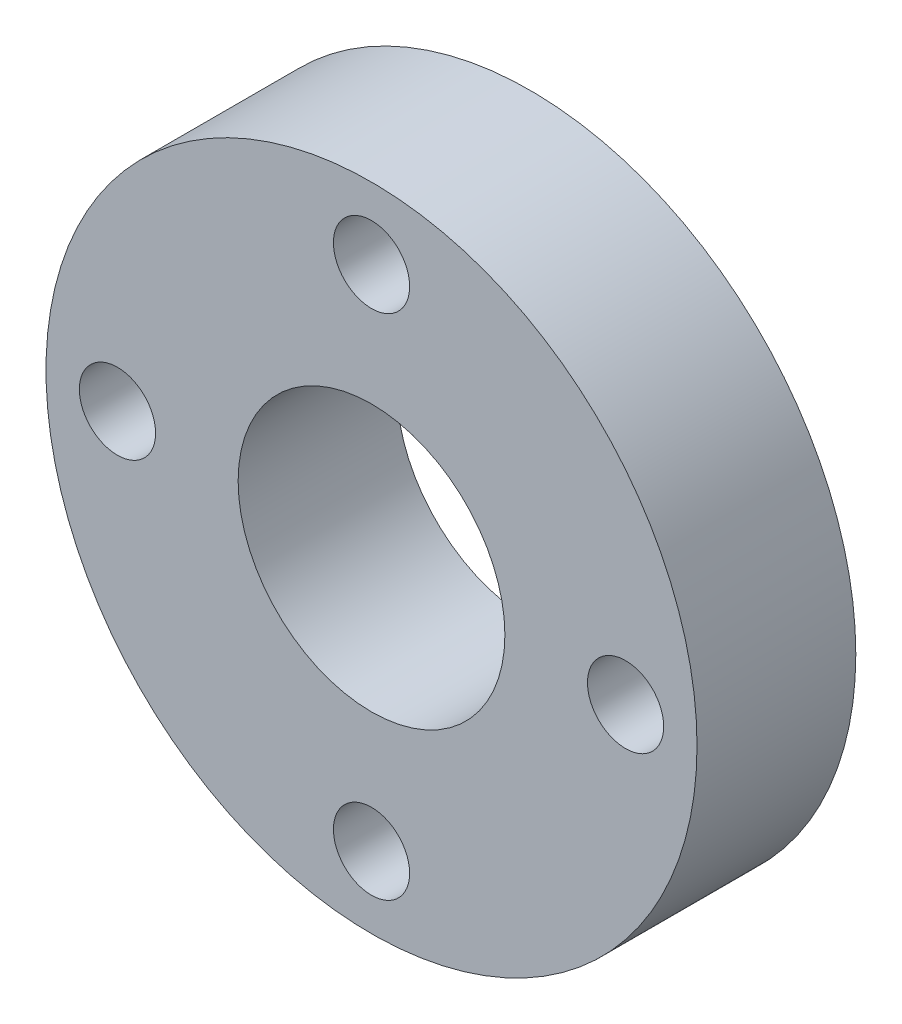
ISO-10303-21;
HEADER;
FILE_DESCRIPTION(('STEP AP214'),'2;1');
FILE_NAME('part.step','',(''),(''),'','','');
FILE_SCHEMA(('AUTOMOTIVE_DESIGN { 1 0 10303 214 1 1 1 1 }'));
ENDSEC;
DATA;
#1=APPLICATION_CONTEXT('core data for automotive mechanical design processes');
#2=APPLICATION_PROTOCOL_DEFINITION('international standard','automotive_design',2000,#1);
#3=PRODUCT_CONTEXT('',#1,'mechanical');
#4=PRODUCT('Part','Part','',(#3));
#5=PRODUCT_RELATED_PRODUCT_CATEGORY('part','',(#4));
#6=PRODUCT_DEFINITION_FORMATION('','',#4);
#7=PRODUCT_DEFINITION_CONTEXT('part definition',#1,'design');
#8=PRODUCT_DEFINITION('design','',#6,#7);
#9=PRODUCT_DEFINITION_SHAPE('','',#8);
#10=(LENGTH_UNIT() NAMED_UNIT(*) SI_UNIT(.MILLI.,.METRE.));
#11=(NAMED_UNIT(*) PLANE_ANGLE_UNIT() SI_UNIT($,.RADIAN.));
#12=(NAMED_UNIT(*) SI_UNIT($,.STERADIAN.) SOLID_ANGLE_UNIT());
#13=UNCERTAINTY_MEASURE_WITH_UNIT(LENGTH_MEASURE(1.E-05),#10,'distance_accuracy_value','');
#14=(GEOMETRIC_REPRESENTATION_CONTEXT(3) GLOBAL_UNCERTAINTY_ASSIGNED_CONTEXT((#13)) GLOBAL_UNIT_ASSIGNED_CONTEXT((#10,
#11,#12)) REPRESENTATION_CONTEXT('',''));
#15=CARTESIAN_POINT('',(0.,0.,0.));
#16=DIRECTION('',(0.,0.,1.));
#17=DIRECTION('',(1.,0.,0.));
#18=AXIS2_PLACEMENT_3D('',#15,#16,#17);
#19=CARTESIAN_POINT('',(0.,0.,5.));
#20=DIRECTION('',(0.,0.,-1.));
#21=DIRECTION('',(-1.,0.,0.));
#22=AXIS2_PLACEMENT_3D('',#19,#20,#21);
#23=CYLINDRICAL_SURFACE('',#22,10.25);
#24=CARTESIAN_POINT('',(0.,0.,5.));
#25=DIRECTION('',(0.,0.,1.));
#26=DIRECTION('',(1.,0.,0.));
#27=AXIS2_PLACEMENT_3D('',#24,#25,#26);
#28=CIRCLE('',#27,10.25);
#29=CARTESIAN_POINT('',(10.25,0.,5.));
#30=VERTEX_POINT('',#29);
#31=EDGE_CURVE('E49',#30,#30,#28,.T.);
#32=ORIENTED_EDGE('',*,*,#31,.F.);
#33=EDGE_LOOP('',(#32));
#34=FACE_BOUND('',#33,.T.);
#35=CARTESIAN_POINT('',(0.,0.,0.));
#36=DIRECTION('',(0.,0.,1.));
#37=DIRECTION('',(1.,0.,0.));
#38=AXIS2_PLACEMENT_3D('',#35,#36,#37);
#39=CIRCLE('',#38,10.25);
#40=CARTESIAN_POINT('',(10.25,0.,0.));
#41=VERTEX_POINT('',#40);
#42=EDGE_CURVE('E69',#41,#41,#39,.T.);
#43=ORIENTED_EDGE('',*,*,#42,.T.);
#44=EDGE_LOOP('',(#43));
#45=FACE_BOUND('',#44,.T.);
#46=ADVANCED_FACE('F41',(#34,#45),#23,.T.);
#47=CARTESIAN_POINT('',(0.,-8.,5.));
#48=DIRECTION('',(0.,0.,-1.));
#49=DIRECTION('',(-1.,0.,0.));
#50=AXIS2_PLACEMENT_3D('',#47,#48,#49);
#51=CYLINDRICAL_SURFACE('',#50,1.2);
#52=CARTESIAN_POINT('',(0.,-8.,5.));
#53=DIRECTION('',(0.,0.,1.));
#54=DIRECTION('',(1.,0.,0.));
#55=AXIS2_PLACEMENT_3D('',#52,#53,#54);
#56=CIRCLE('',#55,1.2);
#57=CARTESIAN_POINT('',(1.19999999999994,-8.,5.));
#58=VERTEX_POINT('',#57);
#59=EDGE_CURVE('E54',#58,#58,#56,.T.);
#60=ORIENTED_EDGE('',*,*,#59,.T.);
#61=EDGE_LOOP('',(#60));
#62=FACE_BOUND('',#61,.T.);
#63=CARTESIAN_POINT('',(0.,-8.,0.));
#64=DIRECTION('',(0.,0.,1.));
#65=DIRECTION('',(1.,0.,0.));
#66=AXIS2_PLACEMENT_3D('',#63,#64,#65);
#67=CIRCLE('',#66,1.2);
#68=CARTESIAN_POINT('',(1.19999999999994,-8.,0.));
#69=VERTEX_POINT('',#68);
#70=EDGE_CURVE('E67',#69,#69,#67,.T.);
#71=ORIENTED_EDGE('',*,*,#70,.F.);
#72=EDGE_LOOP('',(#71));
#73=FACE_BOUND('',#72,.T.);
#74=ADVANCED_FACE('F90',(#62,#73),#51,.F.);
#75=CARTESIAN_POINT('',(8.,0.,5.));
#76=DIRECTION('',(0.,0.,-1.));
#77=DIRECTION('',(-1.,0.,0.));
#78=AXIS2_PLACEMENT_3D('',#75,#76,#77);
#79=CYLINDRICAL_SURFACE('',#78,1.2);
#80=CARTESIAN_POINT('',(8.,0.,5.));
#81=DIRECTION('',(0.,0.,1.));
#82=DIRECTION('',(1.,0.,0.));
#83=AXIS2_PLACEMENT_3D('',#80,#81,#82);
#84=CIRCLE('',#83,1.2);
#85=CARTESIAN_POINT('',(9.2,0.,5.));
#86=VERTEX_POINT('',#85);
#87=EDGE_CURVE('E83',#86,#86,#84,.T.);
#88=ORIENTED_EDGE('',*,*,#87,.T.);
#89=EDGE_LOOP('',(#88));
#90=FACE_BOUND('',#89,.T.);
#91=CARTESIAN_POINT('',(8.,0.,0.));
#92=DIRECTION('',(0.,0.,1.));
#93=DIRECTION('',(1.,0.,0.));
#94=AXIS2_PLACEMENT_3D('',#91,#92,#93);
#95=CIRCLE('',#94,1.2);
#96=CARTESIAN_POINT('',(9.2,0.,0.));
#97=VERTEX_POINT('',#96);
#98=EDGE_CURVE('E64',#97,#97,#95,.T.);
#99=ORIENTED_EDGE('',*,*,#98,.F.);
#100=EDGE_LOOP('',(#99));
#101=FACE_BOUND('',#100,.T.);
#102=ADVANCED_FACE('F108',(#90,#101),#79,.F.);
#103=CARTESIAN_POINT('',(0.,8.,5.));
#104=DIRECTION('',(0.,0.,-1.));
#105=DIRECTION('',(-1.,0.,0.));
#106=AXIS2_PLACEMENT_3D('',#103,#104,#105);
#107=CYLINDRICAL_SURFACE('',#106,1.2);
#108=CARTESIAN_POINT('',(0.,8.,5.));
#109=DIRECTION('',(0.,0.,1.));
#110=DIRECTION('',(1.,0.,0.));
#111=AXIS2_PLACEMENT_3D('',#108,#109,#110);
#112=CIRCLE('',#111,1.2);
#113=CARTESIAN_POINT('',(1.2,8.,5.));
#114=VERTEX_POINT('',#113);
#115=EDGE_CURVE('E78',#114,#114,#112,.T.);
#116=ORIENTED_EDGE('',*,*,#115,.T.);
#117=EDGE_LOOP('',(#116));
#118=FACE_BOUND('',#117,.T.);
#119=CARTESIAN_POINT('',(0.,8.,0.));
#120=DIRECTION('',(0.,0.,1.));
#121=DIRECTION('',(1.,0.,0.));
#122=AXIS2_PLACEMENT_3D('',#119,#120,#121);
#123=CIRCLE('',#122,1.2);
#124=CARTESIAN_POINT('',(1.2,8.,0.));
#125=VERTEX_POINT('',#124);
#126=EDGE_CURVE('E61',#125,#125,#123,.T.);
#127=ORIENTED_EDGE('',*,*,#126,.F.);
#128=EDGE_LOOP('',(#127));
#129=FACE_BOUND('',#128,.T.);
#130=ADVANCED_FACE('F114',(#118,#129),#107,.F.);
#131=CARTESIAN_POINT('',(-8.,0.,5.));
#132=DIRECTION('',(0.,0.,-1.));
#133=DIRECTION('',(-1.,0.,0.));
#134=AXIS2_PLACEMENT_3D('',#131,#132,#133);
#135=CYLINDRICAL_SURFACE('',#134,1.2);
#136=CARTESIAN_POINT('',(-8.,0.,5.));
#137=DIRECTION('',(0.,0.,1.));
#138=DIRECTION('',(1.,0.,0.));
#139=AXIS2_PLACEMENT_3D('',#136,#137,#138);
#140=CIRCLE('',#139,1.2);
#141=CARTESIAN_POINT('',(-6.8,0.,5.));
#142=VERTEX_POINT('',#141);
#143=EDGE_CURVE('E74',#142,#142,#140,.T.);
#144=ORIENTED_EDGE('',*,*,#143,.T.);
#145=EDGE_LOOP('',(#144));
#146=FACE_BOUND('',#145,.T.);
#147=CARTESIAN_POINT('',(-8.,0.,0.));
#148=DIRECTION('',(0.,0.,1.));
#149=DIRECTION('',(1.,0.,0.));
#150=AXIS2_PLACEMENT_3D('',#147,#148,#149);
#151=CIRCLE('',#150,1.2);
#152=CARTESIAN_POINT('',(-6.8,0.,0.));
#153=VERTEX_POINT('',#152);
#154=EDGE_CURVE('E58',#153,#153,#151,.T.);
#155=ORIENTED_EDGE('',*,*,#154,.F.);
#156=EDGE_LOOP('',(#155));
#157=FACE_BOUND('',#156,.T.);
#158=ADVANCED_FACE('F43',(#146,#157),#135,.F.);
#159=CARTESIAN_POINT('',(0.,0.,5.));
#160=DIRECTION('',(0.,0.,-1.));
#161=DIRECTION('',(-1.,0.,0.));
#162=AXIS2_PLACEMENT_3D('',#159,#160,#161);
#163=CYLINDRICAL_SURFACE('',#162,4.2);
#164=CARTESIAN_POINT('',(0.,0.,5.));
#165=DIRECTION('',(0.,0.,1.));
#166=DIRECTION('',(1.,0.,0.));
#167=AXIS2_PLACEMENT_3D('',#164,#165,#166);
#168=CIRCLE('',#167,4.2);
#169=CARTESIAN_POINT('',(4.2,0.,5.));
#170=VERTEX_POINT('',#169);
#171=EDGE_CURVE('E10',#170,#170,#168,.T.);
#172=ORIENTED_EDGE('',*,*,#171,.T.);
#173=EDGE_LOOP('',(#172));
#174=FACE_BOUND('',#173,.T.);
#175=CARTESIAN_POINT('',(0.,0.,0.));
#176=DIRECTION('',(0.,0.,1.));
#177=DIRECTION('',(1.,0.,0.));
#178=AXIS2_PLACEMENT_3D('',#175,#176,#177);
#179=CIRCLE('',#178,4.2);
#180=CARTESIAN_POINT('',(4.2,0.,0.));
#181=VERTEX_POINT('',#180);
#182=EDGE_CURVE('E45',#181,#181,#179,.T.);
#183=ORIENTED_EDGE('',*,*,#182,.F.);
#184=EDGE_LOOP('',(#183));
#185=FACE_BOUND('',#184,.T.);
#186=ADVANCED_FACE('F97',(#174,#185),#163,.F.);
#187=CARTESIAN_POINT('',(0.,0.,5.));
#188=DIRECTION('',(0.,0.,1.));
#189=DIRECTION('',(1.,0.,0.));
#190=AXIS2_PLACEMENT_3D('',#187,#188,#189);
#191=PLANE('',#190);
#192=ORIENTED_EDGE('',*,*,#143,.F.);
#193=EDGE_LOOP('',(#192));
#194=FACE_BOUND('',#193,.T.);
#195=ORIENTED_EDGE('',*,*,#115,.F.);
#196=EDGE_LOOP('',(#195));
#197=FACE_BOUND('',#196,.T.);
#198=ORIENTED_EDGE('',*,*,#87,.F.);
#199=EDGE_LOOP('',(#198));
#200=FACE_BOUND('',#199,.T.);
#201=ORIENTED_EDGE('',*,*,#59,.F.);
#202=EDGE_LOOP('',(#201));
#203=FACE_BOUND('',#202,.T.);
#204=ORIENTED_EDGE('',*,*,#31,.T.);
#205=EDGE_LOOP('',(#204));
#206=FACE_BOUND('',#205,.T.);
#207=ORIENTED_EDGE('',*,*,#171,.F.);
#208=EDGE_LOOP('',(#207));
#209=FACE_BOUND('',#208,.T.);
#210=ADVANCED_FACE('F93',(#194,#197,#200,#203,#206,#209),#191,.T.);
#211=CARTESIAN_POINT('',(0.,0.,0.));
#212=DIRECTION('',(0.,0.,1.));
#213=DIRECTION('',(1.,0.,0.));
#214=AXIS2_PLACEMENT_3D('',#211,#212,#213);
#215=PLANE('',#214);
#216=ORIENTED_EDGE('',*,*,#154,.T.);
#217=EDGE_LOOP('',(#216));
#218=FACE_BOUND('',#217,.T.);
#219=ORIENTED_EDGE('',*,*,#126,.T.);
#220=EDGE_LOOP('',(#219));
#221=FACE_BOUND('',#220,.T.);
#222=ORIENTED_EDGE('',*,*,#98,.T.);
#223=EDGE_LOOP('',(#222));
#224=FACE_BOUND('',#223,.T.);
#225=ORIENTED_EDGE('',*,*,#70,.T.);
#226=EDGE_LOOP('',(#225));
#227=FACE_BOUND('',#226,.T.);
#228=ORIENTED_EDGE('',*,*,#42,.F.);
#229=EDGE_LOOP('',(#228));
#230=FACE_BOUND('',#229,.T.);
#231=ORIENTED_EDGE('',*,*,#182,.T.);
#232=EDGE_LOOP('',(#231));
#233=FACE_BOUND('',#232,.T.);
#234=ADVANCED_FACE('F96',(#218,#221,#224,#227,#230,#233),#215,.F.);
#235=CLOSED_SHELL('',(#46,#74,#102,#130,#158,#186,#210,#234));
#236=MANIFOLD_SOLID_BREP('B2',#235);
#237=ADVANCED_BREP_SHAPE_REPRESENTATION('',(#18,#236),#14);
#238=SHAPE_DEFINITION_REPRESENTATION(#9,#237);
ENDSEC;
END-ISO-10303-21;
